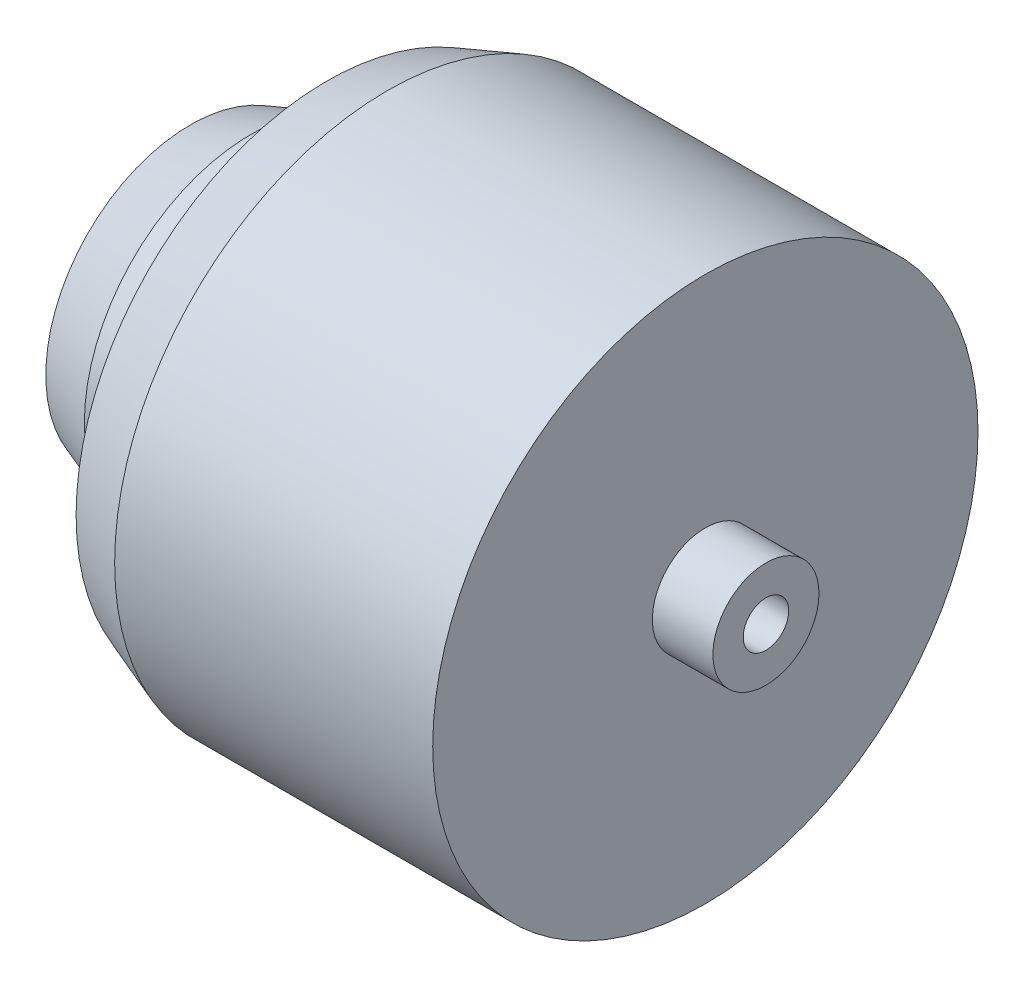
ISO-10303-21;
HEADER;
FILE_DESCRIPTION(('STEP AP214'),'2;1');
FILE_NAME('part.step','',(''),(''),'','','');
FILE_SCHEMA(('AUTOMOTIVE_DESIGN { 1 0 10303 214 1 1 1 1 }'));
ENDSEC;
DATA;
#1=APPLICATION_CONTEXT('core data for automotive mechanical design processes');
#2=APPLICATION_PROTOCOL_DEFINITION('international standard','automotive_design',2000,#1);
#3=PRODUCT_CONTEXT('',#1,'mechanical');
#4=PRODUCT('Part','Part','',(#3));
#5=PRODUCT_RELATED_PRODUCT_CATEGORY('part','',(#4));
#6=PRODUCT_DEFINITION_FORMATION('','',#4);
#7=PRODUCT_DEFINITION_CONTEXT('part definition',#1,'design');
#8=PRODUCT_DEFINITION('design','',#6,#7);
#9=PRODUCT_DEFINITION_SHAPE('','',#8);
#10=(LENGTH_UNIT() NAMED_UNIT(*) SI_UNIT(.MILLI.,.METRE.));
#11=(NAMED_UNIT(*) PLANE_ANGLE_UNIT() SI_UNIT($,.RADIAN.));
#12=(NAMED_UNIT(*) SI_UNIT($,.STERADIAN.) SOLID_ANGLE_UNIT());
#13=UNCERTAINTY_MEASURE_WITH_UNIT(LENGTH_MEASURE(1.E-05),#10,'distance_accuracy_value','');
#14=(GEOMETRIC_REPRESENTATION_CONTEXT(3) GLOBAL_UNCERTAINTY_ASSIGNED_CONTEXT((#13)) GLOBAL_UNIT_ASSIGNED_CONTEXT((#10,
#11,#12)) REPRESENTATION_CONTEXT('',''));
#15=CARTESIAN_POINT('',(0.,0.,0.));
#16=DIRECTION('',(0.,0.,1.));
#17=DIRECTION('',(1.,0.,0.));
#18=AXIS2_PLACEMENT_3D('',#15,#16,#17);
#19=CARTESIAN_POINT('',(38.,1.2490009027033E-13,0.));
#20=DIRECTION('',(-1.,0.,0.));
#21=DIRECTION('',(0.,0.,1.));
#22=AXIS2_PLACEMENT_3D('',#19,#20,#21);
#23=CYLINDRICAL_SURFACE('',#22,18.);
#24=CARTESIAN_POINT('',(13.0000000000001,0.,0.));
#25=DIRECTION('',(-1.,0.,0.));
#26=DIRECTION('',(0.,0.,1.));
#27=AXIS2_PLACEMENT_3D('',#24,#25,#26);
#28=CIRCLE('',#27,18.);
#29=CARTESIAN_POINT('',(13.0000000000001,1.02945429958368E-13,17.9999999999999));
#30=VERTEX_POINT('',#29);
#31=EDGE_CURVE('E83',#30,#30,#28,.F.);
#32=ORIENTED_EDGE('',*,*,#31,.T.);
#33=EDGE_LOOP('',(#32));
#34=FACE_BOUND('',#33,.T.);
#35=CARTESIAN_POINT('',(34.,0.,-1.38777878078145E-13));
#36=DIRECTION('',(1.,0.,0.));
#37=DIRECTION('',(0.,0.,-1.));
#38=AXIS2_PLACEMENT_3D('',#35,#36,#37);
#39=CIRCLE('',#38,18.);
#40=CARTESIAN_POINT('',(34.,0.,-18.0000000000001));
#41=VERTEX_POINT('',#40);
#42=EDGE_CURVE('E75',#41,#41,#39,.T.);
#43=ORIENTED_EDGE('',*,*,#42,.F.);
#44=EDGE_LOOP('',(#43));
#45=FACE_BOUND('',#44,.T.);
#46=ADVANCED_FACE('F43',(#34,#45),#23,.T.);
#47=CARTESIAN_POINT('',(34.,0.,-1.38777878078145E-13));
#48=DIRECTION('',(1.,0.,0.));
#49=DIRECTION('',(0.,0.,-1.));
#50=AXIS2_PLACEMENT_3D('',#47,#48,#49);
#51=PLANE('',#50);
#52=CARTESIAN_POINT('',(34.,0.,-1.38777878078145E-13));
#53=DIRECTION('',(1.,0.,0.));
#54=DIRECTION('',(0.,0.,-1.));
#55=AXIS2_PLACEMENT_3D('',#52,#53,#54);
#56=CIRCLE('',#55,3.5);
#57=CARTESIAN_POINT('',(34.,0.,-3.50000000000014));
#58=VERTEX_POINT('',#57);
#59=EDGE_CURVE('E72',#58,#58,#56,.T.);
#60=ORIENTED_EDGE('',*,*,#59,.F.);
#61=EDGE_LOOP('',(#60));
#62=FACE_BOUND('',#61,.T.);
#63=ORIENTED_EDGE('',*,*,#42,.T.);
#64=EDGE_LOOP('',(#63));
#65=FACE_BOUND('',#64,.T.);
#66=ADVANCED_FACE('F99',(#62,#65),#51,.T.);
#67=CARTESIAN_POINT('',(34.,0.,-1.38777878078145E-13));
#68=DIRECTION('',(1.,0.,0.));
#69=DIRECTION('',(0.,0.,-1.));
#70=AXIS2_PLACEMENT_3D('',#67,#68,#69);
#71=CYLINDRICAL_SURFACE('',#70,3.5);
#72=ORIENTED_EDGE('',*,*,#59,.T.);
#73=EDGE_LOOP('',(#72));
#74=FACE_BOUND('',#73,.T.);
#75=CARTESIAN_POINT('',(38.,1.2490009027033E-13,0.));
#76=DIRECTION('',(1.,0.,0.));
#77=DIRECTION('',(0.,0.,-1.));
#78=AXIS2_PLACEMENT_3D('',#75,#76,#77);
#79=CIRCLE('',#78,3.5);
#80=CARTESIAN_POINT('',(38.,1.22422905146635E-13,-3.50000000000004));
#81=VERTEX_POINT('',#80);
#82=EDGE_CURVE('E67',#81,#81,#79,.T.);
#83=ORIENTED_EDGE('',*,*,#82,.F.);
#84=EDGE_LOOP('',(#83));
#85=FACE_BOUND('',#84,.T.);
#86=ADVANCED_FACE('F105',(#74,#85),#71,.T.);
#87=CARTESIAN_POINT('',(38.,1.2490009027033E-13,0.));
#88=DIRECTION('',(1.,0.,0.));
#89=DIRECTION('',(0.,0.,-1.));
#90=AXIS2_PLACEMENT_3D('',#87,#88,#89);
#91=PLANE('',#90);
#92=CARTESIAN_POINT('',(38.,1.2490009027033E-13,0.));
#93=DIRECTION('',(1.,0.,0.));
#94=DIRECTION('',(0.,0.,-1.));
#95=AXIS2_PLACEMENT_3D('',#92,#93,#94);
#96=CIRCLE('',#95,1.49999999999999);
#97=CARTESIAN_POINT('',(38.,1.23838439503032E-13,-1.50000000000003));
#98=VERTEX_POINT('',#97);
#99=EDGE_CURVE('E64',#98,#98,#96,.T.);
#100=ORIENTED_EDGE('',*,*,#99,.F.);
#101=EDGE_LOOP('',(#100));
#102=FACE_BOUND('',#101,.T.);
#103=ORIENTED_EDGE('',*,*,#82,.T.);
#104=EDGE_LOOP('',(#103));
#105=FACE_BOUND('',#104,.T.);
#106=ADVANCED_FACE('F118',(#102,#105),#91,.T.);
#107=CARTESIAN_POINT('',(9.00000000000004,0.,0.));
#108=DIRECTION('',(-1.,0.,0.));
#109=DIRECTION('',(0.,0.,1.));
#110=AXIS2_PLACEMENT_3D('',#107,#108,#109);
#111=PLANE('',#110);
#112=CARTESIAN_POINT('',(9.00000000000004,0.,0.));
#113=DIRECTION('',(-1.,0.,0.));
#114=DIRECTION('',(0.,0.,1.));
#115=AXIS2_PLACEMENT_3D('',#112,#113,#114);
#116=CIRCLE('',#115,16.5441190629352);
#117=CARTESIAN_POINT('',(9.00000000000004,1.08853899119655E-13,16.5441190629351));
#118=VERTEX_POINT('',#117);
#119=EDGE_CURVE('E80',#118,#118,#116,.T.);
#120=ORIENTED_EDGE('',*,*,#119,.T.);
#121=EDGE_LOOP('',(#120));
#122=FACE_BOUND('',#121,.T.);
#123=CARTESIAN_POINT('',(9.00000000000004,0.,0.));
#124=DIRECTION('',(-1.,0.,0.));
#125=DIRECTION('',(0.,0.,1.));
#126=AXIS2_PLACEMENT_3D('',#123,#124,#125);
#127=CIRCLE('',#126,11.);
#128=CARTESIAN_POINT('',(9.00000000000004,1.04929953614885E-13,10.9999999999999));
#129=VERTEX_POINT('',#128);
#130=EDGE_CURVE('E63',#129,#129,#127,.T.);
#131=ORIENTED_EDGE('',*,*,#130,.F.);
#132=EDGE_LOOP('',(#131));
#133=FACE_BOUND('',#132,.T.);
#134=ADVANCED_FACE('F120',(#122,#133),#111,.T.);
#135=CARTESIAN_POINT('',(9.00000000000004,0.,0.));
#136=DIRECTION('',(-1.,0.,0.));
#137=DIRECTION('',(0.,0.,1.));
#138=AXIS2_PLACEMENT_3D('',#135,#136,#137);
#139=CYLINDRICAL_SURFACE('',#138,11.);
#140=CARTESIAN_POINT('',(4.00000000000002,0.,0.));
#141=DIRECTION('',(1.,0.,0.));
#142=DIRECTION('',(0.,0.,-1.));
#143=AXIS2_PLACEMENT_3D('',#140,#141,#142);
#144=CIRCLE('',#143,11.);
#145=CARTESIAN_POINT('',(4.00000000000002,0.,-11.));
#146=VERTEX_POINT('',#145);
#147=EDGE_CURVE('E12',#146,#146,#144,.T.);
#148=ORIENTED_EDGE('',*,*,#147,.T.);
#149=EDGE_LOOP('',(#148));
#150=FACE_BOUND('',#149,.T.);
#151=ORIENTED_EDGE('',*,*,#130,.T.);
#152=EDGE_LOOP('',(#151));
#153=FACE_BOUND('',#152,.T.);
#154=ADVANCED_FACE('F117',(#150,#153),#139,.T.);
#155=CARTESIAN_POINT('',(0.,0.,0.));
#156=DIRECTION('',(1.,0.,0.));
#157=DIRECTION('',(0.,0.,-1.));
#158=AXIS2_PLACEMENT_3D('',#155,#156,#157);
#159=PLANE('',#158);
#160=CARTESIAN_POINT('',(0.,0.,0.));
#161=DIRECTION('',(1.,0.,0.));
#162=DIRECTION('',(0.,0.,-1.));
#163=AXIS2_PLACEMENT_3D('',#160,#161,#162);
#164=CIRCLE('',#163,9.5441190629352);
#165=CARTESIAN_POINT('',(0.,0.,-9.54411906293519));
#166=VERTEX_POINT('',#165);
#167=EDGE_CURVE('E51',#166,#166,#164,.F.);
#168=ORIENTED_EDGE('',*,*,#167,.T.);
#169=EDGE_LOOP('',(#168));
#170=FACE_BOUND('',#169,.T.);
#171=ADVANCED_FACE('F88',(#170),#159,.F.);
#172=CARTESIAN_POINT('',(9.00000000000004,0.,0.));
#173=DIRECTION('',(1.,0.,0.));
#174=DIRECTION('',(0.,0.,-1.));
#175=AXIS2_PLACEMENT_3D('',#172,#173,#174);
#176=CONICAL_SURFACE('',#175,16.5441190629352,0.349065850398863);
#177=ORIENTED_EDGE('',*,*,#31,.F.);
#178=EDGE_LOOP('',(#177));
#179=FACE_BOUND('',#178,.T.);
#180=ORIENTED_EDGE('',*,*,#119,.F.);
#181=EDGE_LOOP('',(#180));
#182=FACE_BOUND('',#181,.T.);
#183=ADVANCED_FACE('F91',(#179,#182),#176,.T.);
#184=CARTESIAN_POINT('',(0.,0.,0.));
#185=DIRECTION('',(1.,0.,0.));
#186=DIRECTION('',(0.,0.,-1.));
#187=AXIS2_PLACEMENT_3D('',#184,#185,#186);
#188=CONICAL_SURFACE('',#187,9.5441190629352,0.349065850398862);
#189=ORIENTED_EDGE('',*,*,#147,.F.);
#190=EDGE_LOOP('',(#189));
#191=FACE_BOUND('',#190,.T.);
#192=ORIENTED_EDGE('',*,*,#167,.F.);
#193=EDGE_LOOP('',(#192));
#194=FACE_BOUND('',#193,.T.);
#195=ADVANCED_FACE('F46',(#191,#194),#188,.T.);
#196=CARTESIAN_POINT('',(3.90129092854134,0.,0.));
#197=DIRECTION('',(1.,0.,0.));
#198=DIRECTION('',(0.,0.,-1.));
#199=AXIS2_PLACEMENT_3D('',#196,#197,#198);
#200=CONICAL_SURFACE('',#199,1.49999999999999,1.02974425867665);
#201=CARTESIAN_POINT('',(3.,0.,-1.2490009027033E-13));
#202=VERTEX_POINT('',#201);
#203=VERTEX_LOOP('',#202);
#204=FACE_BOUND('',#203,.T.);
#205=CARTESIAN_POINT('',(3.90129092854134,0.,0.));
#206=DIRECTION('',(1.,0.,0.));
#207=DIRECTION('',(0.,0.,-1.));
#208=AXIS2_PLACEMENT_3D('',#205,#206,#207);
#209=CIRCLE('',#208,1.49999999999999);
#210=CARTESIAN_POINT('',(3.90129092854134,0.,-1.50000000000004));
#211=VERTEX_POINT('',#210);
#212=EDGE_CURVE('E61',#211,#211,#209,.T.);
#213=ORIENTED_EDGE('',*,*,#212,.T.);
#214=EDGE_LOOP('',(#213));
#215=FACE_BOUND('',#214,.T.);
#216=ADVANCED_FACE('F54',(#204,#215),#200,.F.);
#217=CARTESIAN_POINT('',(38.,1.2490009027033E-13,0.));
#218=DIRECTION('',(1.,0.,0.));
#219=DIRECTION('',(0.,0.,-1.));
#220=AXIS2_PLACEMENT_3D('',#217,#218,#219);
#221=CYLINDRICAL_SURFACE('',#220,1.49999999999999);
#222=ORIENTED_EDGE('',*,*,#212,.F.);
#223=EDGE_LOOP('',(#222));
#224=FACE_BOUND('',#223,.T.);
#225=ORIENTED_EDGE('',*,*,#99,.T.);
#226=EDGE_LOOP('',(#225));
#227=FACE_BOUND('',#226,.T.);
#228=ADVANCED_FACE('F57',(#224,#227),#221,.F.);
#229=CLOSED_SHELL('',(#46,#66,#86,#106,#134,#154,#171,#183,#195,#216,#228));
#230=MANIFOLD_SOLID_BREP('B2',#229);
#231=ADVANCED_BREP_SHAPE_REPRESENTATION('',(#18,#230),#14);
#232=SHAPE_DEFINITION_REPRESENTATION(#9,#231);
ENDSEC;
END-ISO-10303-21;
